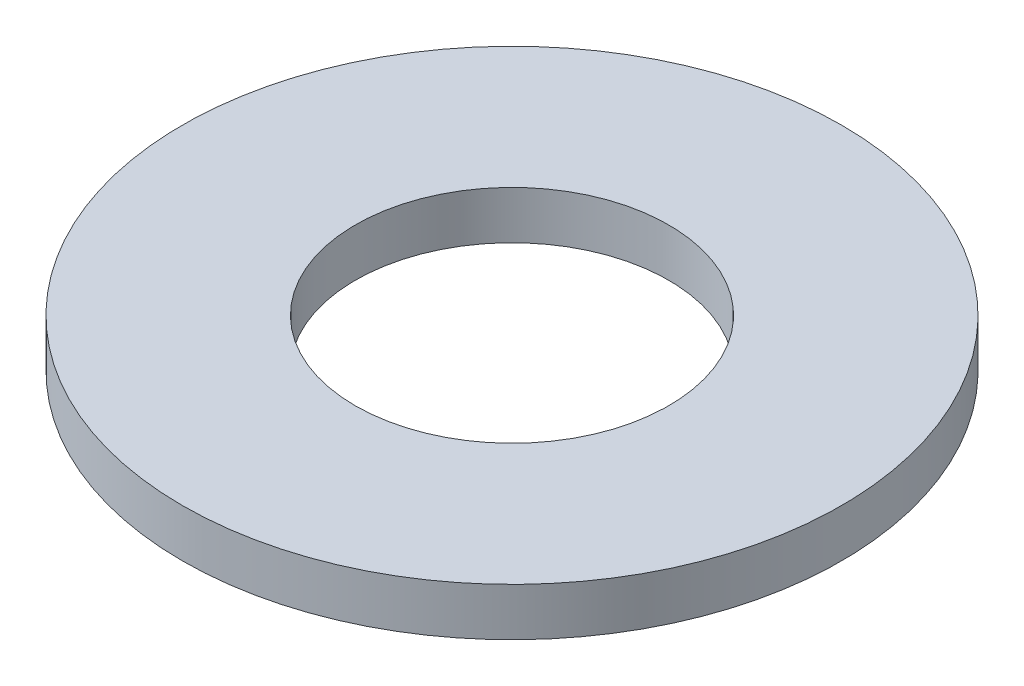
ISO-10303-21;
HEADER;
FILE_DESCRIPTION(('STEP AP214'),'2;1');
FILE_NAME('part.step','',(''),(''),'','','');
FILE_SCHEMA(('AUTOMOTIVE_DESIGN { 1 0 10303 214 1 1 1 1 }'));
ENDSEC;
DATA;
#1=APPLICATION_CONTEXT('core data for automotive mechanical design processes');
#2=APPLICATION_PROTOCOL_DEFINITION('international standard','automotive_design',2000,#1);
#3=PRODUCT_CONTEXT('',#1,'mechanical');
#4=PRODUCT('Part','Part','',(#3));
#5=PRODUCT_RELATED_PRODUCT_CATEGORY('part','',(#4));
#6=PRODUCT_DEFINITION_FORMATION('','',#4);
#7=PRODUCT_DEFINITION_CONTEXT('part definition',#1,'design');
#8=PRODUCT_DEFINITION('design','',#6,#7);
#9=PRODUCT_DEFINITION_SHAPE('','',#8);
#10=(LENGTH_UNIT() NAMED_UNIT(*) SI_UNIT(.MILLI.,.METRE.));
#11=(NAMED_UNIT(*) PLANE_ANGLE_UNIT() SI_UNIT($,.RADIAN.));
#12=(NAMED_UNIT(*) SI_UNIT($,.STERADIAN.) SOLID_ANGLE_UNIT());
#13=UNCERTAINTY_MEASURE_WITH_UNIT(LENGTH_MEASURE(1.E-05),#10,'distance_accuracy_value','');
#14=(GEOMETRIC_REPRESENTATION_CONTEXT(3) GLOBAL_UNCERTAINTY_ASSIGNED_CONTEXT((#13)) GLOBAL_UNIT_ASSIGNED_CONTEXT((#10,
#11,#12)) REPRESENTATION_CONTEXT('',''));
#15=CARTESIAN_POINT('',(0.,0.,0.));
#16=DIRECTION('',(0.,0.,1.));
#17=DIRECTION('',(1.,0.,0.));
#18=AXIS2_PLACEMENT_3D('',#15,#16,#17);
#19=CARTESIAN_POINT('',(0.,0.8,0.));
#20=DIRECTION('',(0.,1.,0.));
#21=DIRECTION('',(0.,0.,1.));
#22=AXIS2_PLACEMENT_3D('',#19,#20,#21);
#23=PLANE('',#22);
#24=CARTESIAN_POINT('',(0.,0.8,0.));
#25=DIRECTION('',(0.,1.,0.));
#26=DIRECTION('',(0.,0.,1.));
#27=AXIS2_PLACEMENT_3D('',#24,#25,#26);
#28=CIRCLE('',#27,5.5);
#29=CARTESIAN_POINT('',(0.,0.8,5.5));
#30=VERTEX_POINT('',#29);
#31=EDGE_CURVE('E10',#30,#30,#28,.T.);
#32=ORIENTED_EDGE('',*,*,#31,.T.);
#33=EDGE_LOOP('',(#32));
#34=FACE_BOUND('',#33,.T.);
#35=CARTESIAN_POINT('',(0.,0.8,0.));
#36=DIRECTION('',(0.,1.,0.));
#37=DIRECTION('',(0.,0.,1.));
#38=AXIS2_PLACEMENT_3D('',#35,#36,#37);
#39=CIRCLE('',#38,2.615);
#40=CARTESIAN_POINT('',(0.,0.8,2.615));
#41=VERTEX_POINT('',#40);
#42=EDGE_CURVE('E44',#41,#41,#39,.T.);
#43=ORIENTED_EDGE('',*,*,#42,.F.);
#44=EDGE_LOOP('',(#43));
#45=FACE_BOUND('',#44,.T.);
#46=ADVANCED_FACE('F33',(#34,#45),#23,.T.);
#47=CARTESIAN_POINT('',(0.,0.,0.));
#48=DIRECTION('',(0.,1.,0.));
#49=DIRECTION('',(0.,0.,1.));
#50=AXIS2_PLACEMENT_3D('',#47,#48,#49);
#51=PLANE('',#50);
#52=CARTESIAN_POINT('',(0.,0.,0.));
#53=DIRECTION('',(0.,1.,0.));
#54=DIRECTION('',(0.,0.,1.));
#55=AXIS2_PLACEMENT_3D('',#52,#53,#54);
#56=CIRCLE('',#55,5.5);
#57=CARTESIAN_POINT('',(0.,0.,5.5));
#58=VERTEX_POINT('',#57);
#59=EDGE_CURVE('E37',#58,#58,#56,.T.);
#60=ORIENTED_EDGE('',*,*,#59,.F.);
#61=EDGE_LOOP('',(#60));
#62=FACE_BOUND('',#61,.T.);
#63=CARTESIAN_POINT('',(0.,0.,0.));
#64=DIRECTION('',(0.,1.,0.));
#65=DIRECTION('',(0.,0.,1.));
#66=AXIS2_PLACEMENT_3D('',#63,#64,#65);
#67=CIRCLE('',#66,2.615);
#68=CARTESIAN_POINT('',(0.,0.,2.615));
#69=VERTEX_POINT('',#68);
#70=EDGE_CURVE('E46',#69,#69,#67,.T.);
#71=ORIENTED_EDGE('',*,*,#70,.T.);
#72=EDGE_LOOP('',(#71));
#73=FACE_BOUND('',#72,.T.);
#74=ADVANCED_FACE('F56',(#62,#73),#51,.F.);
#75=CARTESIAN_POINT('',(0.,0.8,0.));
#76=DIRECTION('',(0.,-1.,0.));
#77=DIRECTION('',(0.,0.,-1.));
#78=AXIS2_PLACEMENT_3D('',#75,#76,#77);
#79=CYLINDRICAL_SURFACE('',#78,5.5);
#80=ORIENTED_EDGE('',*,*,#31,.F.);
#81=EDGE_LOOP('',(#80));
#82=FACE_BOUND('',#81,.T.);
#83=ORIENTED_EDGE('',*,*,#59,.T.);
#84=EDGE_LOOP('',(#83));
#85=FACE_BOUND('',#84,.T.);
#86=ADVANCED_FACE('F35',(#82,#85),#79,.T.);
#87=CARTESIAN_POINT('',(0.,0.8,0.));
#88=DIRECTION('',(0.,-1.,0.));
#89=DIRECTION('',(0.,0.,-1.));
#90=AXIS2_PLACEMENT_3D('',#87,#88,#89);
#91=CYLINDRICAL_SURFACE('',#90,2.615);
#92=ORIENTED_EDGE('',*,*,#42,.T.);
#93=EDGE_LOOP('',(#92));
#94=FACE_BOUND('',#93,.T.);
#95=ORIENTED_EDGE('',*,*,#70,.F.);
#96=EDGE_LOOP('',(#95));
#97=FACE_BOUND('',#96,.T.);
#98=ADVANCED_FACE('F52',(#94,#97),#91,.F.);
#99=CLOSED_SHELL('',(#46,#74,#86,#98));
#100=MANIFOLD_SOLID_BREP('B2',#99);
#101=ADVANCED_BREP_SHAPE_REPRESENTATION('',(#18,#100),#14);
#102=SHAPE_DEFINITION_REPRESENTATION(#9,#101);
ENDSEC;
END-ISO-10303-21;
